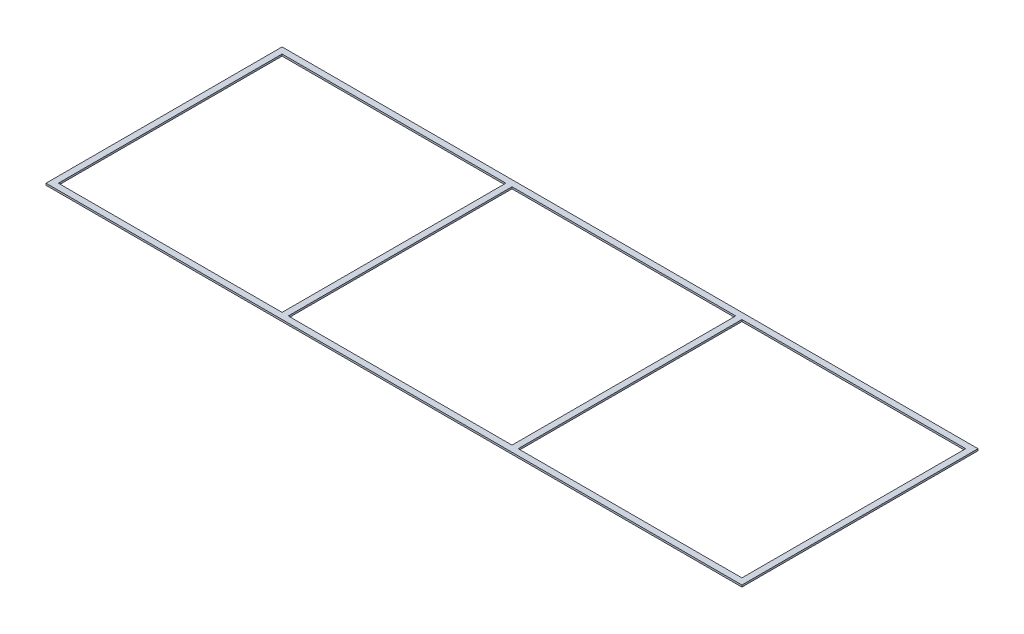
ISO-10303-21;
HEADER;
FILE_DESCRIPTION(('STEP AP214'),'2;1');
FILE_NAME('part.step','',(''),(''),'','','');
FILE_SCHEMA(('AUTOMOTIVE_DESIGN { 1 0 10303 214 1 1 1 1 }'));
ENDSEC;
DATA;
#1=APPLICATION_CONTEXT('core data for automotive mechanical design processes');
#2=APPLICATION_PROTOCOL_DEFINITION('international standard','automotive_design',2000,#1);
#3=PRODUCT_CONTEXT('',#1,'mechanical');
#4=PRODUCT('Part','Part','',(#3));
#5=PRODUCT_RELATED_PRODUCT_CATEGORY('part','',(#4));
#6=PRODUCT_DEFINITION_FORMATION('','',#4);
#7=PRODUCT_DEFINITION_CONTEXT('part definition',#1,'design');
#8=PRODUCT_DEFINITION('design','',#6,#7);
#9=PRODUCT_DEFINITION_SHAPE('','',#8);
#10=(LENGTH_UNIT() NAMED_UNIT(*) SI_UNIT(.MILLI.,.METRE.));
#11=(NAMED_UNIT(*) PLANE_ANGLE_UNIT() SI_UNIT($,.RADIAN.));
#12=(NAMED_UNIT(*) SI_UNIT($,.STERADIAN.) SOLID_ANGLE_UNIT());
#13=UNCERTAINTY_MEASURE_WITH_UNIT(LENGTH_MEASURE(1.E-05),#10,'distance_accuracy_value','');
#14=(GEOMETRIC_REPRESENTATION_CONTEXT(3) GLOBAL_UNCERTAINTY_ASSIGNED_CONTEXT((#13)) GLOBAL_UNIT_ASSIGNED_CONTEXT((#10,
#11,#12)) REPRESENTATION_CONTEXT('',''));
#15=CARTESIAN_POINT('',(0.,0.,0.));
#16=DIRECTION('',(0.,0.,1.));
#17=DIRECTION('',(1.,0.,0.));
#18=AXIS2_PLACEMENT_3D('',#15,#16,#17);
#19=CARTESIAN_POINT('',(0.,0.,0.));
#20=DIRECTION('',(0.,1.,0.));
#21=DIRECTION('',(0.,0.,1.));
#22=AXIS2_PLACEMENT_3D('',#19,#20,#21);
#23=PLANE('',#22);
#24=DIRECTION('',(0.,0.,1.));
#25=VECTOR('',#24,1.);
#26=CARTESIAN_POINT('',(2.3,0.,2.18));
#27=LINE('',#26,#25);
#28=CARTESIAN_POINT('',(2.3,0.,-2.18));
#29=VERTEX_POINT('',#28);
#30=CARTESIAN_POINT('',(2.3,0.,2.18));
#31=VERTEX_POINT('',#30);
#32=EDGE_CURVE('E80',#29,#31,#27,.T.);
#33=ORIENTED_EDGE('',*,*,#32,.F.);
#34=DIRECTION('',(-1.,0.,0.));
#35=VECTOR('',#34,1.);
#36=CARTESIAN_POINT('',(6.66,0.,-2.18));
#37=LINE('',#36,#35);
#38=CARTESIAN_POINT('',(6.66,0.,-2.18));
#39=VERTEX_POINT('',#38);
#40=EDGE_CURVE('E222',#39,#29,#37,.T.);
#41=ORIENTED_EDGE('',*,*,#40,.F.);
#42=DIRECTION('',(0.,0.,-1.));
#43=VECTOR('',#42,1.);
#44=CARTESIAN_POINT('',(6.66,0.,2.18));
#45=LINE('',#44,#43);
#46=CARTESIAN_POINT('',(6.66,0.,2.18));
#47=VERTEX_POINT('',#46);
#48=EDGE_CURVE('E236',#47,#39,#45,.T.);
#49=ORIENTED_EDGE('',*,*,#48,.F.);
#50=DIRECTION('',(1.,0.,0.));
#51=VECTOR('',#50,1.);
#52=CARTESIAN_POINT('',(6.66,0.,2.18));
#53=LINE('',#52,#51);
#54=EDGE_CURVE('E233',#31,#47,#53,.T.);
#55=ORIENTED_EDGE('',*,*,#54,.F.);
#56=EDGE_LOOP('',(#33,#41,#49,#55));
#57=FACE_BOUND('',#56,.T.);
#58=DIRECTION('',(0.,0.,1.));
#59=VECTOR('',#58,1.);
#60=CARTESIAN_POINT('',(-6.66,0.,-2.18));
#61=LINE('',#60,#59);
#62=CARTESIAN_POINT('',(-6.66,0.,-2.18));
#63=VERTEX_POINT('',#62);
#64=CARTESIAN_POINT('',(-6.66,0.,2.18));
#65=VERTEX_POINT('',#64);
#66=EDGE_CURVE('E88',#63,#65,#61,.T.);
#67=ORIENTED_EDGE('',*,*,#66,.F.);
#68=DIRECTION('',(-1.,0.,0.));
#69=VECTOR('',#68,1.);
#70=CARTESIAN_POINT('',(-2.3,0.,-2.18));
#71=LINE('',#70,#69);
#72=CARTESIAN_POINT('',(-2.3,0.,-2.18));
#73=VERTEX_POINT('',#72);
#74=EDGE_CURVE('E198',#73,#63,#71,.T.);
#75=ORIENTED_EDGE('',*,*,#74,.F.);
#76=DIRECTION('',(0.,0.,-1.));
#77=VECTOR('',#76,1.);
#78=CARTESIAN_POINT('',(-2.3,0.,-2.18));
#79=LINE('',#78,#77);
#80=CARTESIAN_POINT('',(-2.3,0.,2.18));
#81=VERTEX_POINT('',#80);
#82=EDGE_CURVE('E201',#81,#73,#79,.T.);
#83=ORIENTED_EDGE('',*,*,#82,.F.);
#84=DIRECTION('',(1.,0.,0.));
#85=VECTOR('',#84,1.);
#86=CARTESIAN_POINT('',(-2.3,0.,2.18));
#87=LINE('',#86,#85);
#88=EDGE_CURVE('E207',#65,#81,#87,.T.);
#89=ORIENTED_EDGE('',*,*,#88,.F.);
#90=EDGE_LOOP('',(#67,#75,#83,#89));
#91=FACE_BOUND('',#90,.T.);
#92=DIRECTION('',(0.,0.,1.));
#93=VECTOR('',#92,1.);
#94=CARTESIAN_POINT('',(-2.18,0.,-2.18));
#95=LINE('',#94,#93);
#96=CARTESIAN_POINT('',(-2.18,0.,-2.18));
#97=VERTEX_POINT('',#96);
#98=CARTESIAN_POINT('',(-2.18,0.,2.18));
#99=VERTEX_POINT('',#98);
#100=EDGE_CURVE('E214',#97,#99,#95,.T.);
#101=ORIENTED_EDGE('',*,*,#100,.F.);
#102=DIRECTION('',(-1.,0.,0.));
#103=VECTOR('',#102,1.);
#104=CARTESIAN_POINT('',(2.18,0.,-2.18));
#105=LINE('',#104,#103);
#106=CARTESIAN_POINT('',(2.18,0.,-2.18));
#107=VERTEX_POINT('',#106);
#108=EDGE_CURVE('E251',#107,#97,#105,.T.);
#109=ORIENTED_EDGE('',*,*,#108,.F.);
#110=DIRECTION('',(0.,0.,-1.));
#111=VECTOR('',#110,1.);
#112=CARTESIAN_POINT('',(2.18,0.,-2.18));
#113=LINE('',#112,#111);
#114=CARTESIAN_POINT('',(2.18,0.,2.18));
#115=VERTEX_POINT('',#114);
#116=EDGE_CURVE('E265',#115,#107,#113,.T.);
#117=ORIENTED_EDGE('',*,*,#116,.F.);
#118=DIRECTION('',(1.,0.,0.));
#119=VECTOR('',#118,1.);
#120=CARTESIAN_POINT('',(2.18,0.,2.18));
#121=LINE('',#120,#119);
#122=EDGE_CURVE('E262',#99,#115,#121,.T.);
#123=ORIENTED_EDGE('',*,*,#122,.F.);
#124=EDGE_LOOP('',(#101,#109,#117,#123));
#125=FACE_BOUND('',#124,.T.);
#126=DIRECTION('',(-1.,0.,0.));
#127=VECTOR('',#126,1.);
#128=CARTESIAN_POINT('',(0.,0.,-2.3));
#129=LINE('',#128,#127);
#130=CARTESIAN_POINT('',(6.78,0.,-2.3));
#131=VERTEX_POINT('',#130);
#132=CARTESIAN_POINT('',(-6.78,0.,-2.3));
#133=VERTEX_POINT('',#132);
#134=EDGE_CURVE('E272',#131,#133,#129,.T.);
#135=ORIENTED_EDGE('',*,*,#134,.T.);
#136=DIRECTION('',(0.,0.,1.));
#137=VECTOR('',#136,1.);
#138=CARTESIAN_POINT('',(-6.78,0.,0.));
#139=LINE('',#138,#137);
#140=CARTESIAN_POINT('',(-6.78,0.,2.3));
#141=VERTEX_POINT('',#140);
#142=EDGE_CURVE('E292',#133,#141,#139,.T.);
#143=ORIENTED_EDGE('',*,*,#142,.T.);
#144=DIRECTION('',(-1.,0.,0.));
#145=VECTOR('',#144,1.);
#146=CARTESIAN_POINT('',(0.,0.,2.3));
#147=LINE('',#146,#145);
#148=CARTESIAN_POINT('',(6.78,0.,2.3));
#149=VERTEX_POINT('',#148);
#150=EDGE_CURVE('E295',#149,#141,#147,.T.);
#151=ORIENTED_EDGE('',*,*,#150,.F.);
#152=DIRECTION('',(0.,0.,1.));
#153=VECTOR('',#152,1.);
#154=CARTESIAN_POINT('',(6.78,0.,0.));
#155=LINE('',#154,#153);
#156=EDGE_CURVE('E283',#131,#149,#155,.T.);
#157=ORIENTED_EDGE('',*,*,#156,.F.);
#158=EDGE_LOOP('',(#135,#143,#151,#157));
#159=FACE_BOUND('',#158,.T.);
#160=ADVANCED_FACE('F63',(#57,#91,#125,#159),#23,.T.);
#161=CARTESIAN_POINT('',(6.78,-0.036,0.));
#162=DIRECTION('',(-1.,0.,0.));
#163=DIRECTION('',(0.,0.,1.));
#164=AXIS2_PLACEMENT_3D('',#161,#162,#163);
#165=PLANE('',#164);
#166=ORIENTED_EDGE('',*,*,#156,.T.);
#167=DIRECTION('',(0.,1.,0.));
#168=VECTOR('',#167,1.);
#169=CARTESIAN_POINT('',(6.78,-0.036,2.3));
#170=LINE('',#169,#168);
#171=CARTESIAN_POINT('',(6.78,-0.036,2.3));
#172=VERTEX_POINT('',#171);
#173=EDGE_CURVE('E72',#172,#149,#170,.T.);
#174=ORIENTED_EDGE('',*,*,#173,.F.);
#175=DIRECTION('',(0.,0.,1.));
#176=VECTOR('',#175,1.);
#177=CARTESIAN_POINT('',(6.78,-0.036,0.));
#178=LINE('',#177,#176);
#179=CARTESIAN_POINT('',(6.78,-0.036,-2.3));
#180=VERTEX_POINT('',#179);
#181=EDGE_CURVE('E288',#180,#172,#178,.T.);
#182=ORIENTED_EDGE('',*,*,#181,.F.);
#183=DIRECTION('',(0.,1.,0.));
#184=VECTOR('',#183,1.);
#185=CARTESIAN_POINT('',(6.78,-0.036,-2.3));
#186=LINE('',#185,#184);
#187=EDGE_CURVE('E12',#180,#131,#186,.T.);
#188=ORIENTED_EDGE('',*,*,#187,.T.);
#189=EDGE_LOOP('',(#166,#174,#182,#188));
#190=FACE_BOUND('',#189,.T.);
#191=ADVANCED_FACE('F314',(#190),#165,.F.);
#192=CARTESIAN_POINT('',(0.,-0.036,-2.3));
#193=DIRECTION('',(0.,0.,-1.));
#194=DIRECTION('',(-1.,0.,0.));
#195=AXIS2_PLACEMENT_3D('',#192,#193,#194);
#196=PLANE('',#195);
#197=ORIENTED_EDGE('',*,*,#134,.F.);
#198=ORIENTED_EDGE('',*,*,#187,.F.);
#199=DIRECTION('',(-1.,0.,0.));
#200=VECTOR('',#199,1.);
#201=CARTESIAN_POINT('',(0.,-0.036,-2.3));
#202=LINE('',#201,#200);
#203=CARTESIAN_POINT('',(-6.78,-0.036,-2.3));
#204=VERTEX_POINT('',#203);
#205=EDGE_CURVE('E279',#180,#204,#202,.T.);
#206=ORIENTED_EDGE('',*,*,#205,.T.);
#207=DIRECTION('',(0.,1.,0.));
#208=VECTOR('',#207,1.);
#209=CARTESIAN_POINT('',(-6.78,-0.036,-2.3));
#210=LINE('',#209,#208);
#211=EDGE_CURVE('E67',#204,#133,#210,.T.);
#212=ORIENTED_EDGE('',*,*,#211,.T.);
#213=EDGE_LOOP('',(#197,#198,#206,#212));
#214=FACE_BOUND('',#213,.T.);
#215=ADVANCED_FACE('F65',(#214),#196,.T.);
#216=CARTESIAN_POINT('',(-6.78,-0.036,0.));
#217=DIRECTION('',(-1.,0.,0.));
#218=DIRECTION('',(0.,0.,1.));
#219=AXIS2_PLACEMENT_3D('',#216,#217,#218);
#220=PLANE('',#219);
#221=ORIENTED_EDGE('',*,*,#142,.F.);
#222=ORIENTED_EDGE('',*,*,#211,.F.);
#223=DIRECTION('',(0.,0.,1.));
#224=VECTOR('',#223,1.);
#225=CARTESIAN_POINT('',(-6.78,-0.036,0.));
#226=LINE('',#225,#224);
#227=CARTESIAN_POINT('',(-6.78,-0.036,2.3));
#228=VERTEX_POINT('',#227);
#229=EDGE_CURVE('E282',#204,#228,#226,.T.);
#230=ORIENTED_EDGE('',*,*,#229,.T.);
#231=DIRECTION('',(0.,1.,0.));
#232=VECTOR('',#231,1.);
#233=CARTESIAN_POINT('',(-6.78,-0.036,2.3));
#234=LINE('',#233,#232);
#235=EDGE_CURVE('E300',#228,#141,#234,.T.);
#236=ORIENTED_EDGE('',*,*,#235,.T.);
#237=EDGE_LOOP('',(#221,#222,#230,#236));
#238=FACE_BOUND('',#237,.T.);
#239=ADVANCED_FACE('F308',(#238),#220,.T.);
#240=CARTESIAN_POINT('',(0.,-0.036,2.3));
#241=DIRECTION('',(0.,0.,-1.));
#242=DIRECTION('',(-1.,0.,0.));
#243=AXIS2_PLACEMENT_3D('',#240,#241,#242);
#244=PLANE('',#243);
#245=ORIENTED_EDGE('',*,*,#150,.T.);
#246=ORIENTED_EDGE('',*,*,#235,.F.);
#247=DIRECTION('',(-1.,0.,0.));
#248=VECTOR('',#247,1.);
#249=CARTESIAN_POINT('',(0.,-0.036,2.3));
#250=LINE('',#249,#248);
#251=EDGE_CURVE('E286',#172,#228,#250,.T.);
#252=ORIENTED_EDGE('',*,*,#251,.F.);
#253=ORIENTED_EDGE('',*,*,#173,.T.);
#254=EDGE_LOOP('',(#245,#246,#252,#253));
#255=FACE_BOUND('',#254,.T.);
#256=ADVANCED_FACE('F318',(#255),#244,.F.);
#257=CARTESIAN_POINT('',(0.,-0.036,0.));
#258=DIRECTION('',(0.,1.,0.));
#259=DIRECTION('',(0.,0.,1.));
#260=AXIS2_PLACEMENT_3D('',#257,#258,#259);
#261=PLANE('',#260);
#262=DIRECTION('',(-1.,0.,0.));
#263=VECTOR('',#262,1.);
#264=CARTESIAN_POINT('',(6.66,-0.036,-2.18));
#265=LINE('',#264,#263);
#266=CARTESIAN_POINT('',(6.66,-0.036,-2.18));
#267=VERTEX_POINT('',#266);
#268=CARTESIAN_POINT('',(2.3,-0.036,-2.18));
#269=VERTEX_POINT('',#268);
#270=EDGE_CURVE('E228',#267,#269,#265,.T.);
#271=ORIENTED_EDGE('',*,*,#270,.T.);
#272=DIRECTION('',(0.,0.,1.));
#273=VECTOR('',#272,1.);
#274=CARTESIAN_POINT('',(2.3,-0.036,2.18));
#275=LINE('',#274,#273);
#276=CARTESIAN_POINT('',(2.3,-0.036,2.18));
#277=VERTEX_POINT('',#276);
#278=EDGE_CURVE('E218',#269,#277,#275,.T.);
#279=ORIENTED_EDGE('',*,*,#278,.T.);
#280=DIRECTION('',(1.,0.,0.));
#281=VECTOR('',#280,1.);
#282=CARTESIAN_POINT('',(6.66,-0.036,2.18));
#283=LINE('',#282,#281);
#284=CARTESIAN_POINT('',(6.66,-0.036,2.18));
#285=VERTEX_POINT('',#284);
#286=EDGE_CURVE('E221',#277,#285,#283,.T.);
#287=ORIENTED_EDGE('',*,*,#286,.T.);
#288=DIRECTION('',(0.,0.,-1.));
#289=VECTOR('',#288,1.);
#290=CARTESIAN_POINT('',(6.66,-0.036,2.18));
#291=LINE('',#290,#289);
#292=EDGE_CURVE('E225',#285,#267,#291,.T.);
#293=ORIENTED_EDGE('',*,*,#292,.T.);
#294=EDGE_LOOP('',(#271,#279,#287,#293));
#295=FACE_BOUND('',#294,.T.);
#296=DIRECTION('',(-1.,0.,0.));
#297=VECTOR('',#296,1.);
#298=CARTESIAN_POINT('',(-2.3,-0.036,-2.18));
#299=LINE('',#298,#297);
#300=CARTESIAN_POINT('',(-2.3,-0.036,-2.18));
#301=VERTEX_POINT('',#300);
#302=CARTESIAN_POINT('',(-6.66,-0.036,-2.18));
#303=VERTEX_POINT('',#302);
#304=EDGE_CURVE('E185',#301,#303,#299,.T.);
#305=ORIENTED_EDGE('',*,*,#304,.T.);
#306=DIRECTION('',(0.,0.,1.));
#307=VECTOR('',#306,1.);
#308=CARTESIAN_POINT('',(-6.66,-0.036,-2.18));
#309=LINE('',#308,#307);
#310=CARTESIAN_POINT('',(-6.66,-0.036,2.18));
#311=VERTEX_POINT('',#310);
#312=EDGE_CURVE('E179',#303,#311,#309,.T.);
#313=ORIENTED_EDGE('',*,*,#312,.T.);
#314=DIRECTION('',(1.,0.,0.));
#315=VECTOR('',#314,1.);
#316=CARTESIAN_POINT('',(-2.3,-0.036,2.18));
#317=LINE('',#316,#315);
#318=CARTESIAN_POINT('',(-2.3,-0.036,2.18));
#319=VERTEX_POINT('',#318);
#320=EDGE_CURVE('E189',#311,#319,#317,.T.);
#321=ORIENTED_EDGE('',*,*,#320,.T.);
#322=DIRECTION('',(0.,0.,-1.));
#323=VECTOR('',#322,1.);
#324=CARTESIAN_POINT('',(-2.3,-0.036,-2.18));
#325=LINE('',#324,#323);
#326=EDGE_CURVE('E193',#319,#301,#325,.T.);
#327=ORIENTED_EDGE('',*,*,#326,.T.);
#328=EDGE_LOOP('',(#305,#313,#321,#327));
#329=FACE_BOUND('',#328,.T.);
#330=DIRECTION('',(-1.,0.,0.));
#331=VECTOR('',#330,1.);
#332=CARTESIAN_POINT('',(2.18,-0.036,-2.18));
#333=LINE('',#332,#331);
#334=CARTESIAN_POINT('',(2.18,-0.036,-2.18));
#335=VERTEX_POINT('',#334);
#336=CARTESIAN_POINT('',(-2.18,-0.036,-2.18));
#337=VERTEX_POINT('',#336);
#338=EDGE_CURVE('E257',#335,#337,#333,.T.);
#339=ORIENTED_EDGE('',*,*,#338,.T.);
#340=DIRECTION('',(0.,0.,1.));
#341=VECTOR('',#340,1.);
#342=CARTESIAN_POINT('',(-2.18,-0.036,-2.18));
#343=LINE('',#342,#341);
#344=CARTESIAN_POINT('',(-2.18,-0.036,2.18));
#345=VERTEX_POINT('',#344);
#346=EDGE_CURVE('E247',#337,#345,#343,.T.);
#347=ORIENTED_EDGE('',*,*,#346,.T.);
#348=DIRECTION('',(1.,0.,0.));
#349=VECTOR('',#348,1.);
#350=CARTESIAN_POINT('',(2.18,-0.036,2.18));
#351=LINE('',#350,#349);
#352=CARTESIAN_POINT('',(2.18,-0.036,2.18));
#353=VERTEX_POINT('',#352);
#354=EDGE_CURVE('E250',#345,#353,#351,.T.);
#355=ORIENTED_EDGE('',*,*,#354,.T.);
#356=DIRECTION('',(0.,0.,-1.));
#357=VECTOR('',#356,1.);
#358=CARTESIAN_POINT('',(2.18,-0.036,-2.18));
#359=LINE('',#358,#357);
#360=EDGE_CURVE('E254',#353,#335,#359,.T.);
#361=ORIENTED_EDGE('',*,*,#360,.T.);
#362=EDGE_LOOP('',(#339,#347,#355,#361));
#363=FACE_BOUND('',#362,.T.);
#364=ORIENTED_EDGE('',*,*,#205,.F.);
#365=ORIENTED_EDGE('',*,*,#181,.T.);
#366=ORIENTED_EDGE('',*,*,#251,.T.);
#367=ORIENTED_EDGE('',*,*,#229,.F.);
#368=EDGE_LOOP('',(#364,#365,#366,#367));
#369=FACE_BOUND('',#368,.T.);
#370=ADVANCED_FACE('F195',(#295,#329,#363,#369),#261,.F.);
#371=CARTESIAN_POINT('',(-2.18,-0.036,-2.18));
#372=DIRECTION('',(-1.,0.,0.));
#373=DIRECTION('',(0.,0.,1.));
#374=AXIS2_PLACEMENT_3D('',#371,#372,#373);
#375=PLANE('',#374);
#376=ORIENTED_EDGE('',*,*,#100,.T.);
#377=DIRECTION('',(0.,1.,0.));
#378=VECTOR('',#377,1.);
#379=CARTESIAN_POINT('',(-2.18,-0.036,2.18));
#380=LINE('',#379,#378);
#381=EDGE_CURVE('E260',#345,#99,#380,.T.);
#382=ORIENTED_EDGE('',*,*,#381,.F.);
#383=ORIENTED_EDGE('',*,*,#346,.F.);
#384=DIRECTION('',(0.,1.,0.));
#385=VECTOR('',#384,1.);
#386=CARTESIAN_POINT('',(-2.18,-0.036,-2.18));
#387=LINE('',#386,#385);
#388=EDGE_CURVE('E270',#337,#97,#387,.T.);
#389=ORIENTED_EDGE('',*,*,#388,.T.);
#390=EDGE_LOOP('',(#376,#382,#383,#389));
#391=FACE_BOUND('',#390,.T.);
#392=ADVANCED_FACE('F321',(#391),#375,.F.);
#393=CARTESIAN_POINT('',(2.18,-0.036,-2.18));
#394=DIRECTION('',(0.,0.,-1.));
#395=DIRECTION('',(-1.,0.,0.));
#396=AXIS2_PLACEMENT_3D('',#393,#394,#395);
#397=PLANE('',#396);
#398=ORIENTED_EDGE('',*,*,#108,.T.);
#399=ORIENTED_EDGE('',*,*,#388,.F.);
#400=ORIENTED_EDGE('',*,*,#338,.F.);
#401=DIRECTION('',(0.,1.,0.));
#402=VECTOR('',#401,1.);
#403=CARTESIAN_POINT('',(2.18,-0.036,-2.18));
#404=LINE('',#403,#402);
#405=EDGE_CURVE('E273',#335,#107,#404,.T.);
#406=ORIENTED_EDGE('',*,*,#405,.T.);
#407=EDGE_LOOP('',(#398,#399,#400,#406));
#408=FACE_BOUND('',#407,.T.);
#409=ADVANCED_FACE('F328',(#408),#397,.F.);
#410=CARTESIAN_POINT('',(2.18,-0.036,-2.18));
#411=DIRECTION('',(1.,0.,0.));
#412=DIRECTION('',(0.,0.,-1.));
#413=AXIS2_PLACEMENT_3D('',#410,#411,#412);
#414=PLANE('',#413);
#415=ORIENTED_EDGE('',*,*,#116,.T.);
#416=ORIENTED_EDGE('',*,*,#405,.F.);
#417=ORIENTED_EDGE('',*,*,#360,.F.);
#418=DIRECTION('',(0.,1.,0.));
#419=VECTOR('',#418,1.);
#420=CARTESIAN_POINT('',(2.18,-0.036,2.18));
#421=LINE('',#420,#419);
#422=EDGE_CURVE('E275',#353,#115,#421,.T.);
#423=ORIENTED_EDGE('',*,*,#422,.T.);
#424=EDGE_LOOP('',(#415,#416,#417,#423));
#425=FACE_BOUND('',#424,.T.);
#426=ADVANCED_FACE('F379',(#425),#414,.F.);
#427=CARTESIAN_POINT('',(2.18,-0.036,2.18));
#428=DIRECTION('',(0.,0.,1.));
#429=DIRECTION('',(1.,0.,0.));
#430=AXIS2_PLACEMENT_3D('',#427,#428,#429);
#431=PLANE('',#430);
#432=ORIENTED_EDGE('',*,*,#122,.T.);
#433=ORIENTED_EDGE('',*,*,#422,.F.);
#434=ORIENTED_EDGE('',*,*,#354,.F.);
#435=ORIENTED_EDGE('',*,*,#381,.T.);
#436=EDGE_LOOP('',(#432,#433,#434,#435));
#437=FACE_BOUND('',#436,.T.);
#438=ADVANCED_FACE('F389',(#437),#431,.F.);
#439=CARTESIAN_POINT('',(-6.66,-0.036,-2.18));
#440=DIRECTION('',(-1.,0.,0.));
#441=DIRECTION('',(0.,0.,1.));
#442=AXIS2_PLACEMENT_3D('',#439,#440,#441);
#443=PLANE('',#442);
#444=ORIENTED_EDGE('',*,*,#66,.T.);
#445=DIRECTION('',(0.,1.,0.));
#446=VECTOR('',#445,1.);
#447=CARTESIAN_POINT('',(-6.66,-0.036,2.18));
#448=LINE('',#447,#446);
#449=EDGE_CURVE('E175',#311,#65,#448,.T.);
#450=ORIENTED_EDGE('',*,*,#449,.F.);
#451=ORIENTED_EDGE('',*,*,#312,.F.);
#452=DIRECTION('',(0.,1.,0.));
#453=VECTOR('',#452,1.);
#454=CARTESIAN_POINT('',(-6.66,-0.036,-2.18));
#455=LINE('',#454,#453);
#456=EDGE_CURVE('E212',#303,#63,#455,.T.);
#457=ORIENTED_EDGE('',*,*,#456,.T.);
#458=EDGE_LOOP('',(#444,#450,#451,#457));
#459=FACE_BOUND('',#458,.T.);
#460=ADVANCED_FACE('F177',(#459),#443,.F.);
#461=CARTESIAN_POINT('',(-2.3,-0.036,-2.18));
#462=DIRECTION('',(0.,0.,-1.));
#463=DIRECTION('',(-1.,0.,0.));
#464=AXIS2_PLACEMENT_3D('',#461,#462,#463);
#465=PLANE('',#464);
#466=ORIENTED_EDGE('',*,*,#74,.T.);
#467=ORIENTED_EDGE('',*,*,#456,.F.);
#468=ORIENTED_EDGE('',*,*,#304,.F.);
#469=DIRECTION('',(0.,1.,0.));
#470=VECTOR('',#469,1.);
#471=CARTESIAN_POINT('',(-2.3,-0.036,-2.18));
#472=LINE('',#471,#470);
#473=EDGE_CURVE('E215',#301,#73,#472,.T.);
#474=ORIENTED_EDGE('',*,*,#473,.T.);
#475=EDGE_LOOP('',(#466,#467,#468,#474));
#476=FACE_BOUND('',#475,.T.);
#477=ADVANCED_FACE('F408',(#476),#465,.F.);
#478=CARTESIAN_POINT('',(-2.3,-0.036,-2.18));
#479=DIRECTION('',(1.,0.,0.));
#480=DIRECTION('',(0.,0.,-1.));
#481=AXIS2_PLACEMENT_3D('',#478,#479,#480);
#482=PLANE('',#481);
#483=ORIENTED_EDGE('',*,*,#82,.T.);
#484=ORIENTED_EDGE('',*,*,#473,.F.);
#485=ORIENTED_EDGE('',*,*,#326,.F.);
#486=DIRECTION('',(0.,1.,0.));
#487=VECTOR('',#486,1.);
#488=CARTESIAN_POINT('',(-2.3,-0.036,2.18));
#489=LINE('',#488,#487);
#490=EDGE_CURVE('E184',#319,#81,#489,.T.);
#491=ORIENTED_EDGE('',*,*,#490,.T.);
#492=EDGE_LOOP('',(#483,#484,#485,#491));
#493=FACE_BOUND('',#492,.T.);
#494=ADVANCED_FACE('F417',(#493),#482,.F.);
#495=CARTESIAN_POINT('',(-2.3,-0.036,2.18));
#496=DIRECTION('',(0.,0.,1.));
#497=DIRECTION('',(1.,0.,0.));
#498=AXIS2_PLACEMENT_3D('',#495,#496,#497);
#499=PLANE('',#498);
#500=ORIENTED_EDGE('',*,*,#88,.T.);
#501=ORIENTED_EDGE('',*,*,#490,.F.);
#502=ORIENTED_EDGE('',*,*,#320,.F.);
#503=ORIENTED_EDGE('',*,*,#449,.T.);
#504=EDGE_LOOP('',(#500,#501,#502,#503));
#505=FACE_BOUND('',#504,.T.);
#506=ADVANCED_FACE('F190',(#505),#499,.F.);
#507=CARTESIAN_POINT('',(2.3,-0.036,2.18));
#508=DIRECTION('',(-1.,0.,0.));
#509=DIRECTION('',(0.,0.,1.));
#510=AXIS2_PLACEMENT_3D('',#507,#508,#509);
#511=PLANE('',#510);
#512=ORIENTED_EDGE('',*,*,#32,.T.);
#513=DIRECTION('',(0.,1.,0.));
#514=VECTOR('',#513,1.);
#515=CARTESIAN_POINT('',(2.3,-0.036,2.18));
#516=LINE('',#515,#514);
#517=EDGE_CURVE('E231',#277,#31,#516,.T.);
#518=ORIENTED_EDGE('',*,*,#517,.F.);
#519=ORIENTED_EDGE('',*,*,#278,.F.);
#520=DIRECTION('',(0.,1.,0.));
#521=VECTOR('',#520,1.);
#522=CARTESIAN_POINT('',(2.3,-0.036,-2.18));
#523=LINE('',#522,#521);
#524=EDGE_CURVE('E208',#269,#29,#523,.T.);
#525=ORIENTED_EDGE('',*,*,#524,.T.);
#526=EDGE_LOOP('',(#512,#518,#519,#525));
#527=FACE_BOUND('',#526,.T.);
#528=ADVANCED_FACE('F436',(#527),#511,.F.);
#529=CARTESIAN_POINT('',(6.66,-0.036,-2.18));
#530=DIRECTION('',(0.,0.,-1.));
#531=DIRECTION('',(-1.,0.,0.));
#532=AXIS2_PLACEMENT_3D('',#529,#530,#531);
#533=PLANE('',#532);
#534=ORIENTED_EDGE('',*,*,#40,.T.);
#535=ORIENTED_EDGE('',*,*,#524,.F.);
#536=ORIENTED_EDGE('',*,*,#270,.F.);
#537=DIRECTION('',(0.,1.,0.));
#538=VECTOR('',#537,1.);
#539=CARTESIAN_POINT('',(6.66,-0.036,-2.18));
#540=LINE('',#539,#538);
#541=EDGE_CURVE('E242',#267,#39,#540,.T.);
#542=ORIENTED_EDGE('',*,*,#541,.T.);
#543=EDGE_LOOP('',(#534,#535,#536,#542));
#544=FACE_BOUND('',#543,.T.);
#545=ADVANCED_FACE('F445',(#544),#533,.F.);
#546=CARTESIAN_POINT('',(6.66,-0.036,2.18));
#547=DIRECTION('',(1.,0.,0.));
#548=DIRECTION('',(0.,0.,-1.));
#549=AXIS2_PLACEMENT_3D('',#546,#547,#548);
#550=PLANE('',#549);
#551=ORIENTED_EDGE('',*,*,#48,.T.);
#552=ORIENTED_EDGE('',*,*,#541,.F.);
#553=ORIENTED_EDGE('',*,*,#292,.F.);
#554=DIRECTION('',(0.,1.,0.));
#555=VECTOR('',#554,1.);
#556=CARTESIAN_POINT('',(6.66,-0.036,2.18));
#557=LINE('',#556,#555);
#558=EDGE_CURVE('E244',#285,#47,#557,.T.);
#559=ORIENTED_EDGE('',*,*,#558,.T.);
#560=EDGE_LOOP('',(#551,#552,#553,#559));
#561=FACE_BOUND('',#560,.T.);
#562=ADVANCED_FACE('F454',(#561),#550,.F.);
#563=CARTESIAN_POINT('',(6.66,-0.036,2.18));
#564=DIRECTION('',(0.,0.,1.));
#565=DIRECTION('',(1.,0.,0.));
#566=AXIS2_PLACEMENT_3D('',#563,#564,#565);
#567=PLANE('',#566);
#568=ORIENTED_EDGE('',*,*,#54,.T.);
#569=ORIENTED_EDGE('',*,*,#558,.F.);
#570=ORIENTED_EDGE('',*,*,#286,.F.);
#571=ORIENTED_EDGE('',*,*,#517,.T.);
#572=EDGE_LOOP('',(#568,#569,#570,#571));
#573=FACE_BOUND('',#572,.T.);
#574=ADVANCED_FACE('F464',(#573),#567,.F.);
#575=CLOSED_SHELL('',(#160,#191,#215,#239,#256,#370,#392,#409,#426,#438,#460,#477,#494,#506,
#528,#545,#562,#574));
#576=MANIFOLD_SOLID_BREP('B2',#575);
#577=ADVANCED_BREP_SHAPE_REPRESENTATION('',(#18,#576),#14);
#578=SHAPE_DEFINITION_REPRESENTATION(#9,#577);
ENDSEC;
END-ISO-10303-21;
